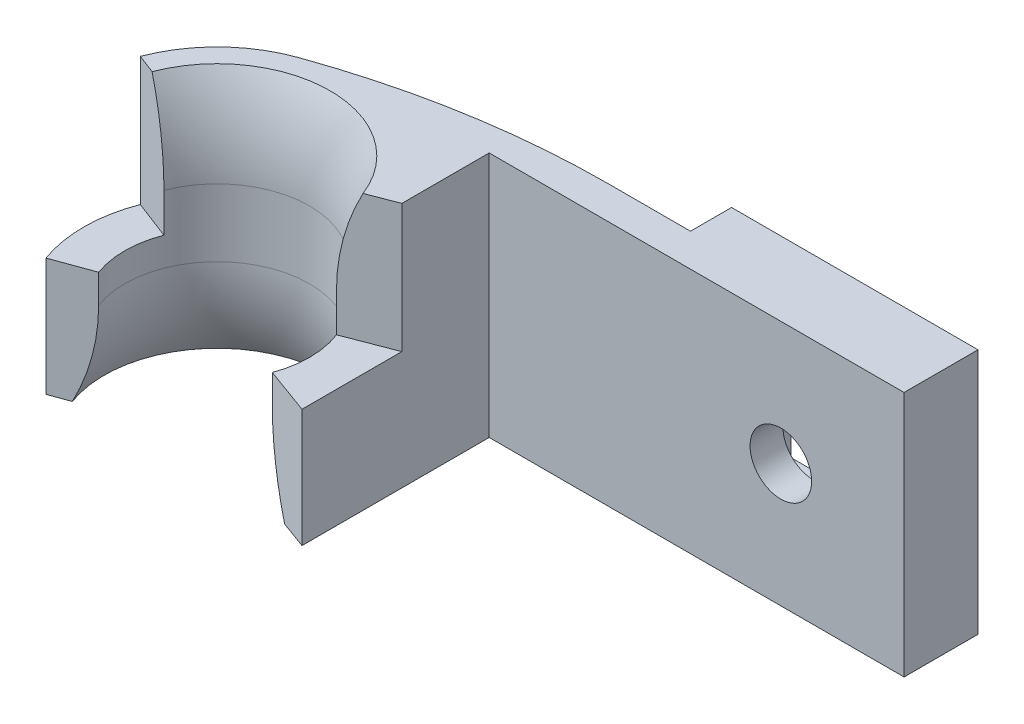
ISO-10303-21;
HEADER;
FILE_DESCRIPTION(('STEP AP214'),'2;1');
FILE_NAME('part.step','',(''),(''),'','','');
FILE_SCHEMA(('AUTOMOTIVE_DESIGN { 1 0 10303 214 1 1 1 1 }'));
ENDSEC;
DATA;
#1=APPLICATION_CONTEXT('core data for automotive mechanical design processes');
#2=APPLICATION_PROTOCOL_DEFINITION('international standard','automotive_design',2000,#1);
#3=PRODUCT_CONTEXT('',#1,'mechanical');
#4=PRODUCT('Part','Part','',(#3));
#5=PRODUCT_RELATED_PRODUCT_CATEGORY('part','',(#4));
#6=PRODUCT_DEFINITION_FORMATION('','',#4);
#7=PRODUCT_DEFINITION_CONTEXT('part definition',#1,'design');
#8=PRODUCT_DEFINITION('design','',#6,#7);
#9=PRODUCT_DEFINITION_SHAPE('','',#8);
#10=(LENGTH_UNIT() NAMED_UNIT(*) SI_UNIT(.MILLI.,.METRE.));
#11=(NAMED_UNIT(*) PLANE_ANGLE_UNIT() SI_UNIT($,.RADIAN.));
#12=(NAMED_UNIT(*) SI_UNIT($,.STERADIAN.) SOLID_ANGLE_UNIT());
#13=UNCERTAINTY_MEASURE_WITH_UNIT(LENGTH_MEASURE(1.E-05),#10,'distance_accuracy_value','');
#14=(GEOMETRIC_REPRESENTATION_CONTEXT(3) GLOBAL_UNCERTAINTY_ASSIGNED_CONTEXT((#13)) GLOBAL_UNIT_ASSIGNED_CONTEXT((#10,
#11,#12)) REPRESENTATION_CONTEXT('',''));
#15=CARTESIAN_POINT('',(0.,0.,0.));
#16=DIRECTION('',(0.,0.,1.));
#17=DIRECTION('',(1.,0.,0.));
#18=AXIS2_PLACEMENT_3D('',#15,#16,#17);
#19=CARTESIAN_POINT('',(-20.7,6.,0.));
#20=DIRECTION('',(0.,-1.,0.));
#21=DIRECTION('',(0.,0.,-1.));
#22=AXIS2_PLACEMENT_3D('',#19,#20,#21);
#23=CYLINDRICAL_SURFACE('',#22,6.5);
#24=DIRECTION('',(0.,-1.,0.));
#25=VECTOR('',#24,1.);
#26=CARTESIAN_POINT('',(-26.7682727722318,21.808608918889,-2.32939167204445));
#27=LINE('',#26,#25);
#28=CARTESIAN_POINT('',(-26.7682727722318,6.,-2.32939167204446));
#29=VERTEX_POINT('',#28);
#30=CARTESIAN_POINT('',(-26.7682727722318,-0.25,-2.32939167204445));
#31=VERTEX_POINT('',#30);
#32=EDGE_CURVE('E234',#29,#31,#27,.T.);
#33=ORIENTED_EDGE('',*,*,#32,.F.);
#34=CARTESIAN_POINT('',(-20.7,6.,0.));
#35=DIRECTION('',(0.,1.,0.));
#36=DIRECTION('',(0.,0.,1.));
#37=AXIS2_PLACEMENT_3D('',#34,#35,#36);
#38=CIRCLE('',#37,6.5);
#39=CARTESIAN_POINT('',(-22.8824234071875,6.,-6.1226651118414));
#40=VERTEX_POINT('',#39);
#41=EDGE_CURVE('E295',#40,#29,#38,.T.);
#42=ORIENTED_EDGE('',*,*,#41,.F.);
#43=DIRECTION('',(0.,-1.,0.));
#44=VECTOR('',#43,1.);
#45=CARTESIAN_POINT('',(-22.8824234071875,6.,-6.1226651118414));
#46=LINE('',#45,#44);
#47=CARTESIAN_POINT('',(-22.8824234071875,-6.,-6.1226651118414));
#48=VERTEX_POINT('',#47);
#49=EDGE_CURVE('E320',#40,#48,#46,.T.);
#50=ORIENTED_EDGE('',*,*,#49,.T.);
#51=CARTESIAN_POINT('',(-20.7,-6.,0.));
#52=DIRECTION('',(0.,1.,0.));
#53=DIRECTION('',(0.,0.,1.));
#54=AXIS2_PLACEMENT_3D('',#51,#52,#53);
#55=CIRCLE('',#54,6.5);
#56=CARTESIAN_POINT('',(-26.8080020351084,-6.,2.22313093161685));
#57=VERTEX_POINT('',#56);
#58=EDGE_CURVE('E309',#48,#57,#55,.T.);
#59=ORIENTED_EDGE('',*,*,#58,.T.);
#60=DIRECTION('',(0.,1.,0.));
#61=VECTOR('',#60,1.);
#62=CARTESIAN_POINT('',(-26.8080020351084,-21.7353908530576,2.22313093161685));
#63=LINE('',#62,#61);
#64=CARTESIAN_POINT('',(-26.8080020351084,-0.25,2.22313093161685));
#65=VERTEX_POINT('',#64);
#66=EDGE_CURVE('E276',#57,#65,#63,.T.);
#67=ORIENTED_EDGE('',*,*,#66,.T.);
#68=CARTESIAN_POINT('',(-20.7,-0.25,0.));
#69=DIRECTION('',(0.,1.,0.));
#70=DIRECTION('',(0.,0.,1.));
#71=AXIS2_PLACEMENT_3D('',#68,#69,#70);
#72=CIRCLE('',#71,6.5);
#73=EDGE_CURVE('E269',#31,#65,#72,.T.);
#74=ORIENTED_EDGE('',*,*,#73,.F.);
#75=EDGE_LOOP('',(#33,#42,#50,#59,#67,#74));
#76=FACE_BOUND('',#75,.T.);
#77=ADVANCED_FACE('F35',(#76),#23,.T.);
#78=CARTESIAN_POINT('',(-20.7,6.,0.));
#79=DIRECTION('',(0.,-1.,0.));
#80=DIRECTION('',(0.,0.,-1.));
#81=AXIS2_PLACEMENT_3D('',#78,#79,#80);
#82=CYLINDRICAL_SURFACE('',#81,4.5);
#83=DIRECTION('',(0.,1.,0.));
#84=VECTOR('',#83,1.);
#85=CARTESIAN_POINT('',(-24.9286167935366,-21.7353908530576,1.53909064496551));
#86=LINE('',#85,#84);
#87=CARTESIAN_POINT('',(-24.9286167935366,-1.64110105645931,1.53909064496551));
#88=VERTEX_POINT('',#87);
#89=CARTESIAN_POINT('',(-24.9286167935366,-0.25,1.53909064496551));
#90=VERTEX_POINT('',#89);
#91=EDGE_CURVE('E261',#88,#90,#86,.T.);
#92=ORIENTED_EDGE('',*,*,#91,.F.);
#93=CARTESIAN_POINT('',(-20.7,-1.64110105645931,0.));
#94=DIRECTION('',(0.,-1.,0.));
#95=DIRECTION('',(0.,0.,-1.));
#96=AXIS2_PLACEMENT_3D('',#93,#94,#95);
#97=CIRCLE('',#96,4.5);
#98=CARTESIAN_POINT('',(-16.4713832064634,-1.64110105645931,1.53909064496551));
#99=VERTEX_POINT('',#98);
#100=EDGE_CURVE('E332',#88,#99,#97,.T.);
#101=ORIENTED_EDGE('',*,*,#100,.T.);
#102=DIRECTION('',(0.,1.,0.));
#103=VECTOR('',#102,1.);
#104=CARTESIAN_POINT('',(-16.4713832064634,-21.7353908530576,1.53909064496551));
#105=LINE('',#104,#103);
#106=CARTESIAN_POINT('',(-16.4713832064634,-0.25,1.53909064496551));
#107=VERTEX_POINT('',#106);
#108=EDGE_CURVE('E274',#99,#107,#105,.T.);
#109=ORIENTED_EDGE('',*,*,#108,.T.);
#110=CARTESIAN_POINT('',(-20.7,-0.25,0.));
#111=DIRECTION('',(0.,-1.,0.));
#112=DIRECTION('',(0.,0.,1.));
#113=AXIS2_PLACEMENT_3D('',#110,#111,#112);
#114=CIRCLE('',#113,4.5);
#115=CARTESIAN_POINT('',(-16.4988880807626,-0.25,-1.61265577295385));
#116=VERTEX_POINT('',#115);
#117=EDGE_CURVE('E250',#116,#107,#114,.T.);
#118=ORIENTED_EDGE('',*,*,#117,.F.);
#119=DIRECTION('',(0.,-1.,0.));
#120=VECTOR('',#119,1.);
#121=CARTESIAN_POINT('',(-16.4988880807626,21.808608918889,-1.61265577295385));
#122=LINE('',#121,#120);
#123=CARTESIAN_POINT('',(-16.4988880807626,1.64110105645934,-1.61265577295385));
#124=VERTEX_POINT('',#123);
#125=EDGE_CURVE('E245',#124,#116,#122,.T.);
#126=ORIENTED_EDGE('',*,*,#125,.F.);
#127=CARTESIAN_POINT('',(-20.7,1.64110105645934,0.));
#128=DIRECTION('',(0.,1.,0.));
#129=DIRECTION('',(0.,0.,1.));
#130=AXIS2_PLACEMENT_3D('',#127,#128,#129);
#131=CIRCLE('',#130,4.5);
#132=CARTESIAN_POINT('',(-24.9011119192374,1.64110105645934,-1.61265577295385));
#133=VERTEX_POINT('',#132);
#134=EDGE_CURVE('E329',#124,#133,#131,.T.);
#135=ORIENTED_EDGE('',*,*,#134,.T.);
#136=DIRECTION('',(0.,-1.,0.));
#137=VECTOR('',#136,1.);
#138=CARTESIAN_POINT('',(-24.9011119192374,21.808608918889,-1.61265577295385));
#139=LINE('',#138,#137);
#140=CARTESIAN_POINT('',(-24.9011119192374,-0.25,-1.61265577295385));
#141=VERTEX_POINT('',#140);
#142=EDGE_CURVE('E241',#133,#141,#139,.T.);
#143=ORIENTED_EDGE('',*,*,#142,.T.);
#144=EDGE_CURVE('E262',#90,#141,#114,.T.);
#145=ORIENTED_EDGE('',*,*,#144,.F.);
#146=EDGE_LOOP('',(#92,#101,#109,#118,#126,#135,#143,#145));
#147=FACE_BOUND('',#146,.T.);
#148=ADVANCED_FACE('F359',(#147),#82,.F.);
#149=CARTESIAN_POINT('',(-14.2,6.,-6.75));
#150=DIRECTION('',(-1.,0.,0.));
#151=DIRECTION('',(0.,0.,1.));
#152=AXIS2_PLACEMENT_3D('',#149,#150,#151);
#153=PLANE('',#152);
#154=DIRECTION('',(0.,-1.,0.));
#155=VECTOR('',#154,1.);
#156=CARTESIAN_POINT('',(-14.2,21.808608918889,-2.49511622773021));
#157=LINE('',#156,#155);
#158=CARTESIAN_POINT('',(-14.2,6.,-2.49511622773021));
#159=VERTEX_POINT('',#158);
#160=CARTESIAN_POINT('',(-14.2,-0.25,-2.49511622773021));
#161=VERTEX_POINT('',#160);
#162=EDGE_CURVE('E246',#159,#161,#157,.T.);
#163=ORIENTED_EDGE('',*,*,#162,.T.);
#164=DIRECTION('',(0.,0.,-1.));
#165=VECTOR('',#164,1.);
#166=CARTESIAN_POINT('',(-14.2,-0.25,0.));
#167=LINE('',#166,#165);
#168=CARTESIAN_POINT('',(-14.2,-0.25,2.36580652273032));
#169=VERTEX_POINT('',#168);
#170=EDGE_CURVE('E267',#169,#161,#167,.T.);
#171=ORIENTED_EDGE('',*,*,#170,.F.);
#172=DIRECTION('',(0.,1.,0.));
#173=VECTOR('',#172,1.);
#174=CARTESIAN_POINT('',(-14.2,-21.7353908530576,2.36580652273032));
#175=LINE('',#174,#173);
#176=CARTESIAN_POINT('',(-14.2,-6.,2.36580652273032));
#177=VERTEX_POINT('',#176);
#178=EDGE_CURVE('E279',#177,#169,#175,.T.);
#179=ORIENTED_EDGE('',*,*,#178,.F.);
#180=DIRECTION('',(0.,0.,-1.));
#181=VECTOR('',#180,1.);
#182=CARTESIAN_POINT('',(-14.2,-6.,-6.75));
#183=LINE('',#182,#181);
#184=CARTESIAN_POINT('',(-14.2,-6.,-6.75));
#185=VERTEX_POINT('',#184);
#186=EDGE_CURVE('E312',#177,#185,#183,.T.);
#187=ORIENTED_EDGE('',*,*,#186,.T.);
#188=DIRECTION('',(0.,-1.,0.));
#189=VECTOR('',#188,1.);
#190=CARTESIAN_POINT('',(-14.2,6.,-6.75));
#191=LINE('',#190,#189);
#192=CARTESIAN_POINT('',(-14.2,6.,-6.75));
#193=VERTEX_POINT('',#192);
#194=EDGE_CURVE('E317',#193,#185,#191,.T.);
#195=ORIENTED_EDGE('',*,*,#194,.F.);
#196=DIRECTION('',(0.,0.,-1.));
#197=VECTOR('',#196,1.);
#198=CARTESIAN_POINT('',(-14.2,6.,-6.75));
#199=LINE('',#198,#197);
#200=EDGE_CURVE('E298',#159,#193,#199,.T.);
#201=ORIENTED_EDGE('',*,*,#200,.F.);
#202=EDGE_LOOP('',(#163,#171,#179,#187,#195,#201));
#203=FACE_BOUND('',#202,.T.);
#204=ADVANCED_FACE('F368',(#203),#153,.F.);
#205=CARTESIAN_POINT('',(-20.7,6.,0.));
#206=DIRECTION('',(0.,1.,0.));
#207=DIRECTION('',(0.,0.,1.));
#208=AXIS2_PLACEMENT_3D('',#205,#206,#207);
#209=PLANE('',#208);
#210=DIRECTION('',(-0.933580426497202,0.,-0.3583679495453));
#211=VECTOR('',#210,1.);
#212=CARTESIAN_POINT('',(-24.9011119192374,6.,-1.61265577295385));
#213=LINE('',#212,#211);
#214=CARTESIAN_POINT('',(-25.8346923457346,6.,-1.97102372249915));
#215=VERTEX_POINT('',#214);
#216=EDGE_CURVE('E240',#215,#29,#213,.T.);
#217=ORIENTED_EDGE('',*,*,#216,.F.);
#218=CARTESIAN_POINT('',(-20.7,6.,0.));
#219=DIRECTION('',(0.,1.,0.));
#220=DIRECTION('',(0.,0.,1.));
#221=AXIS2_PLACEMENT_3D('',#218,#219,#220);
#222=CIRCLE('',#221,5.5);
#223=CARTESIAN_POINT('',(-15.5653076542654,6.,-1.97102372249915));
#224=VERTEX_POINT('',#223);
#225=EDGE_CURVE('E327',#215,#224,#222,.F.);
#226=ORIENTED_EDGE('',*,*,#225,.T.);
#227=DIRECTION('',(-0.933580426497201,0.,0.358367949545301));
#228=VECTOR('',#227,1.);
#229=CARTESIAN_POINT('',(-16.4988880807626,6.,-1.61265577295385));
#230=LINE('',#229,#228);
#231=EDGE_CURVE('E247',#159,#224,#230,.T.);
#232=ORIENTED_EDGE('',*,*,#231,.F.);
#233=ORIENTED_EDGE('',*,*,#200,.T.);
#234=DIRECTION('',(1.,0.,0.));
#235=VECTOR('',#234,1.);
#236=CARTESIAN_POINT('',(6.,6.,-6.75));
#237=LINE('',#236,#235);
#238=CARTESIAN_POINT('',(6.,6.,-6.75));
#239=VERTEX_POINT('',#238);
#240=EDGE_CURVE('E300',#193,#239,#237,.T.);
#241=ORIENTED_EDGE('',*,*,#240,.T.);
#242=DIRECTION('',(0.,0.,-1.));
#243=VECTOR('',#242,1.);
#244=CARTESIAN_POINT('',(6.,6.,-8.35));
#245=LINE('',#244,#243);
#246=CARTESIAN_POINT('',(6.,6.,-10.35));
#247=VERTEX_POINT('',#246);
#248=EDGE_CURVE('E289',#239,#247,#245,.T.);
#249=ORIENTED_EDGE('',*,*,#248,.T.);
#250=DIRECTION('',(-1.,0.,0.));
#251=VECTOR('',#250,1.);
#252=CARTESIAN_POINT('',(6.,6.,-10.35));
#253=LINE('',#252,#251);
#254=CARTESIAN_POINT('',(-6.,6.,-10.35));
#255=VERTEX_POINT('',#254);
#256=EDGE_CURVE('E220',#247,#255,#253,.T.);
#257=ORIENTED_EDGE('',*,*,#256,.T.);
#258=DIRECTION('',(0.,0.,1.));
#259=VECTOR('',#258,1.);
#260=CARTESIAN_POINT('',(-6.,6.,-8.35));
#261=LINE('',#260,#259);
#262=CARTESIAN_POINT('',(-6.,6.,-8.35));
#263=VERTEX_POINT('',#262);
#264=EDGE_CURVE('E221',#255,#263,#261,.T.);
#265=ORIENTED_EDGE('',*,*,#264,.T.);
#266=DIRECTION('',(-1.,0.,0.));
#267=VECTOR('',#266,1.);
#268=CARTESIAN_POINT('',(-10.,6.,-8.35));
#269=LINE('',#268,#267);
#270=CARTESIAN_POINT('',(-9.99999999999999,6.,-8.35));
#271=VERTEX_POINT('',#270);
#272=EDGE_CURVE('E58',#263,#271,#269,.T.);
#273=ORIENTED_EDGE('',*,*,#272,.T.);
#274=CARTESIAN_POINT('',(-10.,6.,30.0182432432432));
#275=DIRECTION('',(0.,1.,0.));
#276=DIRECTION('',(0.,0.,1.));
#277=AXIS2_PLACEMENT_3D('',#274,#275,#276);
#278=CIRCLE('',#277,38.3682432432432);
#279=EDGE_CURVE('E293',#271,#40,#278,.T.);
#280=ORIENTED_EDGE('',*,*,#279,.T.);
#281=ORIENTED_EDGE('',*,*,#41,.T.);
#282=EDGE_LOOP('',(#217,#226,#232,#233,#241,#249,#257,#265,#273,#280,#281));
#283=FACE_BOUND('',#282,.T.);
#284=ADVANCED_FACE('F348',(#283),#209,.T.);
#285=CARTESIAN_POINT('',(6.,6.,-8.35));
#286=DIRECTION('',(-1.,0.,0.));
#287=DIRECTION('',(0.,0.,1.));
#288=AXIS2_PLACEMENT_3D('',#285,#286,#287);
#289=PLANE('',#288);
#290=DIRECTION('',(0.,0.,-1.));
#291=VECTOR('',#290,1.);
#292=CARTESIAN_POINT('',(6.,-6.,-8.35));
#293=LINE('',#292,#291);
#294=CARTESIAN_POINT('',(6.,-6.,-6.75));
#295=VERTEX_POINT('',#294);
#296=CARTESIAN_POINT('',(6.,-6.,-10.35));
#297=VERTEX_POINT('',#296);
#298=EDGE_CURVE('E288',#295,#297,#293,.T.);
#299=ORIENTED_EDGE('',*,*,#298,.T.);
#300=DIRECTION('',(0.,1.,0.));
#301=VECTOR('',#300,1.);
#302=CARTESIAN_POINT('',(6.,6.,-10.35));
#303=LINE('',#302,#301);
#304=EDGE_CURVE('E217',#297,#247,#303,.T.);
#305=ORIENTED_EDGE('',*,*,#304,.T.);
#306=ORIENTED_EDGE('',*,*,#248,.F.);
#307=DIRECTION('',(0.,-1.,0.));
#308=VECTOR('',#307,1.);
#309=CARTESIAN_POINT('',(6.,6.,-6.75));
#310=LINE('',#309,#308);
#311=EDGE_CURVE('E302',#239,#295,#310,.T.);
#312=ORIENTED_EDGE('',*,*,#311,.T.);
#313=EDGE_LOOP('',(#299,#305,#306,#312));
#314=FACE_BOUND('',#313,.T.);
#315=ADVANCED_FACE('F379',(#314),#289,.F.);
#316=CARTESIAN_POINT('',(-10.,6.,-8.35));
#317=DIRECTION('',(0.,0.,1.));
#318=DIRECTION('',(1.,0.,0.));
#319=AXIS2_PLACEMENT_3D('',#316,#317,#318);
#320=PLANE('',#319);
#321=ORIENTED_EDGE('',*,*,#272,.F.);
#322=DIRECTION('',(0.,-1.,0.));
#323=VECTOR('',#322,1.);
#324=CARTESIAN_POINT('',(-6.,6.,-8.35));
#325=LINE('',#324,#323);
#326=CARTESIAN_POINT('',(-6.,-6.,-8.35));
#327=VERTEX_POINT('',#326);
#328=EDGE_CURVE('E222',#263,#327,#325,.T.);
#329=ORIENTED_EDGE('',*,*,#328,.T.);
#330=DIRECTION('',(-1.,0.,0.));
#331=VECTOR('',#330,1.);
#332=CARTESIAN_POINT('',(-10.,-6.,-8.35));
#333=LINE('',#332,#331);
#334=CARTESIAN_POINT('',(-9.99999999999999,-6.,-8.35));
#335=VERTEX_POINT('',#334);
#336=EDGE_CURVE('E304',#327,#335,#333,.T.);
#337=ORIENTED_EDGE('',*,*,#336,.T.);
#338=DIRECTION('',(0.,-1.,0.));
#339=VECTOR('',#338,1.);
#340=CARTESIAN_POINT('',(-9.99999999999999,6.,-8.35));
#341=LINE('',#340,#339);
#342=EDGE_CURVE('E322',#271,#335,#341,.T.);
#343=ORIENTED_EDGE('',*,*,#342,.F.);
#344=EDGE_LOOP('',(#321,#329,#337,#343));
#345=FACE_BOUND('',#344,.T.);
#346=ADVANCED_FACE('F391',(#345),#320,.F.);
#347=CARTESIAN_POINT('',(-10.,6.,30.0182432432432));
#348=DIRECTION('',(0.,-1.,0.));
#349=DIRECTION('',(0.,0.,-1.));
#350=AXIS2_PLACEMENT_3D('',#347,#348,#349);
#351=CYLINDRICAL_SURFACE('',#350,38.3682432432432);
#352=CARTESIAN_POINT('',(-10.,-6.,30.0182432432432));
#353=DIRECTION('',(0.,1.,0.));
#354=DIRECTION('',(0.,0.,1.));
#355=AXIS2_PLACEMENT_3D('',#352,#353,#354);
#356=CIRCLE('',#355,38.3682432432432);
#357=EDGE_CURVE('E306',#335,#48,#356,.T.);
#358=ORIENTED_EDGE('',*,*,#357,.T.);
#359=ORIENTED_EDGE('',*,*,#49,.F.);
#360=ORIENTED_EDGE('',*,*,#279,.F.);
#361=ORIENTED_EDGE('',*,*,#342,.T.);
#362=EDGE_LOOP('',(#358,#359,#360,#361));
#363=FACE_BOUND('',#362,.T.);
#364=ADVANCED_FACE('F396',(#363),#351,.T.);
#365=CARTESIAN_POINT('',(6.,6.,-6.75));
#366=DIRECTION('',(0.,0.,-1.));
#367=DIRECTION('',(-1.,0.,0.));
#368=AXIS2_PLACEMENT_3D('',#365,#366,#367);
#369=PLANE('',#368);
#370=CARTESIAN_POINT('',(0.,0.,-6.75));
#371=DIRECTION('',(0.,0.,1.));
#372=DIRECTION('',(1.,0.,0.));
#373=AXIS2_PLACEMENT_3D('',#370,#371,#372);
#374=CIRCLE('',#373,1.5);
#375=CARTESIAN_POINT('',(1.5,0.,-6.75));
#376=VERTEX_POINT('',#375);
#377=EDGE_CURVE('E285',#376,#376,#374,.T.);
#378=ORIENTED_EDGE('',*,*,#377,.F.);
#379=EDGE_LOOP('',(#378));
#380=FACE_BOUND('',#379,.T.);
#381=DIRECTION('',(1.,0.,0.));
#382=VECTOR('',#381,1.);
#383=CARTESIAN_POINT('',(6.,-6.,-6.75));
#384=LINE('',#383,#382);
#385=EDGE_CURVE('E291',#185,#295,#384,.T.);
#386=ORIENTED_EDGE('',*,*,#385,.T.);
#387=ORIENTED_EDGE('',*,*,#311,.F.);
#388=ORIENTED_EDGE('',*,*,#240,.F.);
#389=ORIENTED_EDGE('',*,*,#194,.T.);
#390=EDGE_LOOP('',(#386,#387,#388,#389));
#391=FACE_BOUND('',#390,.T.);
#392=ADVANCED_FACE('F375',(#380,#391),#369,.F.);
#393=CARTESIAN_POINT('',(-20.7,-6.,0.));
#394=DIRECTION('',(0.,1.,0.));
#395=DIRECTION('',(0.,0.,1.));
#396=AXIS2_PLACEMENT_3D('',#393,#394,#395);
#397=PLANE('',#396);
#398=DIRECTION('',(-0.939692620785908,0.,-0.34202014332567));
#399=VECTOR('',#398,1.);
#400=CARTESIAN_POINT('',(-16.4713832064634,-6.,1.53909064496551));
#401=LINE('',#400,#399);
#402=CARTESIAN_POINT('',(-15.5316905856775,-6.,1.88111078829119));
#403=VERTEX_POINT('',#402);
#404=EDGE_CURVE('E260',#177,#403,#401,.T.);
#405=ORIENTED_EDGE('',*,*,#404,.T.);
#406=CARTESIAN_POINT('',(-20.7,-6.,0.));
#407=DIRECTION('',(0.,1.,0.));
#408=DIRECTION('',(0.,0.,1.));
#409=AXIS2_PLACEMENT_3D('',#406,#407,#408);
#410=CIRCLE('',#409,5.50000000000001);
#411=CARTESIAN_POINT('',(-25.8683094143225,-6.,1.88111078829119));
#412=VERTEX_POINT('',#411);
#413=EDGE_CURVE('E325',#403,#412,#410,.T.);
#414=ORIENTED_EDGE('',*,*,#413,.T.);
#415=DIRECTION('',(-0.939692620785908,0.,0.34202014332567));
#416=VECTOR('',#415,1.);
#417=CARTESIAN_POINT('',(-24.9286167935366,-6.,1.53909064496551));
#418=LINE('',#417,#416);
#419=EDGE_CURVE('E258',#412,#57,#418,.T.);
#420=ORIENTED_EDGE('',*,*,#419,.T.);
#421=ORIENTED_EDGE('',*,*,#58,.F.);
#422=ORIENTED_EDGE('',*,*,#357,.F.);
#423=ORIENTED_EDGE('',*,*,#336,.F.);
#424=DIRECTION('',(0.,0.,-1.));
#425=VECTOR('',#424,1.);
#426=CARTESIAN_POINT('',(-6.,-6.,-10.35));
#427=LINE('',#426,#425);
#428=CARTESIAN_POINT('',(-6.,-6.,-10.35));
#429=VERTEX_POINT('',#428);
#430=EDGE_CURVE('E224',#327,#429,#427,.T.);
#431=ORIENTED_EDGE('',*,*,#430,.T.);
#432=DIRECTION('',(-1.,0.,0.));
#433=VECTOR('',#432,1.);
#434=CARTESIAN_POINT('',(6.,-6.,-10.35));
#435=LINE('',#434,#433);
#436=EDGE_CURVE('E231',#297,#429,#435,.T.);
#437=ORIENTED_EDGE('',*,*,#436,.F.);
#438=ORIENTED_EDGE('',*,*,#298,.F.);
#439=ORIENTED_EDGE('',*,*,#385,.F.);
#440=ORIENTED_EDGE('',*,*,#186,.F.);
#441=EDGE_LOOP('',(#405,#414,#420,#421,#422,#423,#431,#437,#438,#439,#440));
#442=FACE_BOUND('',#441,.T.);
#443=ADVANCED_FACE('F399',(#442),#397,.F.);
#444=CARTESIAN_POINT('',(0.,0.,-8.351));
#445=DIRECTION('',(0.,0.,1.));
#446=DIRECTION('',(1.,0.,0.));
#447=AXIS2_PLACEMENT_3D('',#444,#445,#446);
#448=CYLINDRICAL_SURFACE('',#447,1.5);
#449=ORIENTED_EDGE('',*,*,#377,.T.);
#450=EDGE_LOOP('',(#449));
#451=FACE_BOUND('',#450,.T.);
#452=CARTESIAN_POINT('',(0.,0.,-8.35));
#453=DIRECTION('',(0.,0.,-1.));
#454=DIRECTION('',(-1.,0.,0.));
#455=AXIS2_PLACEMENT_3D('',#452,#453,#454);
#456=CIRCLE('',#455,1.5);
#457=CARTESIAN_POINT('',(-1.5,0.,-8.35));
#458=VERTEX_POINT('',#457);
#459=EDGE_CURVE('E213',#458,#458,#456,.F.);
#460=ORIENTED_EDGE('',*,*,#459,.F.);
#461=EDGE_LOOP('',(#460));
#462=FACE_BOUND('',#461,.T.);
#463=ADVANCED_FACE('F418',(#451,#462),#448,.F.);
#464=CARTESIAN_POINT('',(-16.4713832064634,-21.7353908530576,1.53909064496551));
#465=DIRECTION('',(-0.34202014332567,0.,0.939692620785908));
#466=DIRECTION('',(0.939692620785908,0.,0.34202014332567));
#467=AXIS2_PLACEMENT_3D('',#464,#465,#466);
#468=PLANE('',#467);
#469=ORIENTED_EDGE('',*,*,#108,.F.);
#470=CARTESIAN_POINT('',(-7.07445699860433,-1.64110105645931,4.95929207822221));
#471=DIRECTION('',(-0.34202014332567,0.,0.939692620785908));
#472=DIRECTION('',(0.939692620785908,0.,0.34202014332567));
#473=AXIS2_PLACEMENT_3D('',#470,#471,#472);
#474=CIRCLE('',#473,10.);
#475=EDGE_CURVE('E335',#99,#403,#474,.T.);
#476=ORIENTED_EDGE('',*,*,#475,.T.);
#477=ORIENTED_EDGE('',*,*,#404,.F.);
#478=ORIENTED_EDGE('',*,*,#178,.T.);
#479=DIRECTION('',(0.939692620785908,0.,0.34202014332567));
#480=VECTOR('',#479,1.);
#481=CARTESIAN_POINT('',(-16.4713832064634,-0.25,1.53909064496551));
#482=LINE('',#481,#480);
#483=EDGE_CURVE('E265',#107,#169,#482,.T.);
#484=ORIENTED_EDGE('',*,*,#483,.F.);
#485=EDGE_LOOP('',(#469,#476,#477,#478,#484));
#486=FACE_BOUND('',#485,.T.);
#487=ADVANCED_FACE('F416',(#486),#468,.T.);
#488=CARTESIAN_POINT('',(-20.7,-0.25,0.));
#489=DIRECTION('',(0.,1.,0.));
#490=DIRECTION('',(0.,0.,1.));
#491=AXIS2_PLACEMENT_3D('',#488,#489,#490);
#492=PLANE('',#491);
#493=ORIENTED_EDGE('',*,*,#483,.T.);
#494=ORIENTED_EDGE('',*,*,#170,.T.);
#495=DIRECTION('',(-0.933580426497201,0.,0.358367949545301));
#496=VECTOR('',#495,1.);
#497=CARTESIAN_POINT('',(-16.4988880807626,-0.25,-1.61265577295385));
#498=LINE('',#497,#496);
#499=EDGE_CURVE('E242',#161,#116,#498,.T.);
#500=ORIENTED_EDGE('',*,*,#499,.T.);
#501=ORIENTED_EDGE('',*,*,#117,.T.);
#502=EDGE_LOOP('',(#493,#494,#500,#501));
#503=FACE_BOUND('',#502,.T.);
#504=ADVANCED_FACE('F364',(#503),#492,.T.);
#505=ORIENTED_EDGE('',*,*,#144,.T.);
#506=DIRECTION('',(-0.933580426497202,0.,-0.3583679495453));
#507=VECTOR('',#506,1.);
#508=CARTESIAN_POINT('',(-24.9011119192374,-0.25,-1.61265577295385));
#509=LINE('',#508,#507);
#510=EDGE_CURVE('E237',#141,#31,#509,.T.);
#511=ORIENTED_EDGE('',*,*,#510,.T.);
#512=ORIENTED_EDGE('',*,*,#73,.T.);
#513=DIRECTION('',(0.939692620785908,0.,-0.34202014332567));
#514=VECTOR('',#513,1.);
#515=CARTESIAN_POINT('',(-24.9286167935366,-0.25,1.53909064496551));
#516=LINE('',#515,#514);
#517=EDGE_CURVE('E271',#65,#90,#516,.T.);
#518=ORIENTED_EDGE('',*,*,#517,.T.);
#519=EDGE_LOOP('',(#505,#511,#512,#518));
#520=FACE_BOUND('',#519,.T.);
#521=ADVANCED_FACE('F409',(#520),#492,.T.);
#522=CARTESIAN_POINT('',(-24.9286167935366,-21.7353908530576,1.53909064496551));
#523=DIRECTION('',(0.34202014332567,0.,0.939692620785908));
#524=DIRECTION('',(0.939692620785908,0.,-0.34202014332567));
#525=AXIS2_PLACEMENT_3D('',#522,#523,#524);
#526=PLANE('',#525);
#527=ORIENTED_EDGE('',*,*,#419,.F.);
#528=CARTESIAN_POINT('',(-34.3255430013957,-1.64110105645931,4.95929207822221));
#529=DIRECTION('',(0.34202014332567,0.,0.939692620785908));
#530=DIRECTION('',(0.939692620785908,0.,-0.34202014332567));
#531=AXIS2_PLACEMENT_3D('',#528,#529,#530);
#532=CIRCLE('',#531,10.);
#533=EDGE_CURVE('E337',#412,#88,#532,.T.);
#534=ORIENTED_EDGE('',*,*,#533,.T.);
#535=ORIENTED_EDGE('',*,*,#91,.T.);
#536=ORIENTED_EDGE('',*,*,#517,.F.);
#537=ORIENTED_EDGE('',*,*,#66,.F.);
#538=EDGE_LOOP('',(#527,#534,#535,#536,#537));
#539=FACE_BOUND('',#538,.T.);
#540=ADVANCED_FACE('F405',(#539),#526,.T.);
#541=CARTESIAN_POINT('',(-24.9011119192374,21.808608918889,-1.61265577295385));
#542=DIRECTION('',(-0.3583679495453,0.,0.933580426497202));
#543=DIRECTION('',(0.933580426497202,0.,0.3583679495453));
#544=AXIS2_PLACEMENT_3D('',#541,#542,#543);
#545=PLANE('',#544);
#546=ORIENTED_EDGE('',*,*,#142,.F.);
#547=CARTESIAN_POINT('',(-34.2369161842094,1.64110105645934,-5.19633526840686));
#548=DIRECTION('',(-0.3583679495453,0.,0.933580426497202));
#549=DIRECTION('',(0.933580426497202,0.,0.3583679495453));
#550=AXIS2_PLACEMENT_3D('',#547,#548,#549);
#551=CIRCLE('',#550,10.);
#552=EDGE_CURVE('E43',#133,#215,#551,.T.);
#553=ORIENTED_EDGE('',*,*,#552,.T.);
#554=ORIENTED_EDGE('',*,*,#216,.T.);
#555=ORIENTED_EDGE('',*,*,#32,.T.);
#556=ORIENTED_EDGE('',*,*,#510,.F.);
#557=EDGE_LOOP('',(#546,#553,#554,#555,#556));
#558=FACE_BOUND('',#557,.T.);
#559=ADVANCED_FACE('F341',(#558),#545,.T.);
#560=CARTESIAN_POINT('',(-16.4988880807626,21.808608918889,-1.61265577295385));
#561=DIRECTION('',(0.358367949545301,0.,0.933580426497201));
#562=DIRECTION('',(0.933580426497201,0.,-0.358367949545301));
#563=AXIS2_PLACEMENT_3D('',#560,#561,#562);
#564=PLANE('',#563);
#565=ORIENTED_EDGE('',*,*,#231,.T.);
#566=CARTESIAN_POINT('',(-7.16308381579058,1.64110105645934,-5.19633526840687));
#567=DIRECTION('',(0.358367949545301,0.,0.933580426497201));
#568=DIRECTION('',(0.933580426497201,0.,-0.358367949545301));
#569=AXIS2_PLACEMENT_3D('',#566,#567,#568);
#570=CIRCLE('',#569,10.);
#571=EDGE_CURVE('E11',#224,#124,#570,.T.);
#572=ORIENTED_EDGE('',*,*,#571,.T.);
#573=ORIENTED_EDGE('',*,*,#125,.T.);
#574=ORIENTED_EDGE('',*,*,#499,.F.);
#575=ORIENTED_EDGE('',*,*,#162,.F.);
#576=EDGE_LOOP('',(#565,#572,#573,#574,#575));
#577=FACE_BOUND('',#576,.T.);
#578=ADVANCED_FACE('F354',(#577),#564,.T.);
#579=CARTESIAN_POINT('',(-20.7,-1.64110105645931,0.));
#580=DIRECTION('',(0.,-1.,0.));
#581=DIRECTION('',(0.,0.,-1.));
#582=AXIS2_PLACEMENT_3D('',#579,#580,#581);
#583=TOROIDAL_SURFACE('',#582,14.5,10.);
#584=ORIENTED_EDGE('',*,*,#533,.F.);
#585=ORIENTED_EDGE('',*,*,#413,.F.);
#586=ORIENTED_EDGE('',*,*,#475,.F.);
#587=ORIENTED_EDGE('',*,*,#100,.F.);
#588=EDGE_LOOP('',(#584,#585,#586,#587));
#589=FACE_BOUND('',#588,.T.);
#590=ADVANCED_FACE('F412',(#589),#583,.T.);
#591=CARTESIAN_POINT('',(-20.7,1.64110105645934,0.));
#592=DIRECTION('',(0.,1.,0.));
#593=DIRECTION('',(0.,0.,1.));
#594=AXIS2_PLACEMENT_3D('',#591,#592,#593);
#595=TOROIDAL_SURFACE('',#594,14.5,10.);
#596=ORIENTED_EDGE('',*,*,#571,.F.);
#597=ORIENTED_EDGE('',*,*,#225,.F.);
#598=ORIENTED_EDGE('',*,*,#552,.F.);
#599=ORIENTED_EDGE('',*,*,#134,.F.);
#600=EDGE_LOOP('',(#596,#597,#598,#599));
#601=FACE_BOUND('',#600,.T.);
#602=ADVANCED_FACE('F37',(#601),#595,.T.);
#603=CARTESIAN_POINT('',(6.,6.,-10.35));
#604=DIRECTION('',(0.,0.,1.));
#605=DIRECTION('',(0.,-1.,0.));
#606=AXIS2_PLACEMENT_3D('',#603,#604,#605);
#607=PLANE('',#606);
#608=DIRECTION('',(1.,0.,0.));
#609=VECTOR('',#608,1.);
#610=CARTESIAN_POINT('',(3.1,3.1,-10.35));
#611=LINE('',#610,#609);
#612=CARTESIAN_POINT('',(-3.1,3.1,-10.35));
#613=VERTEX_POINT('',#612);
#614=CARTESIAN_POINT('',(3.1,3.1,-10.35));
#615=VERTEX_POINT('',#614);
#616=EDGE_CURVE('E207',#613,#615,#611,.T.);
#617=ORIENTED_EDGE('',*,*,#616,.F.);
#618=DIRECTION('',(0.,1.,0.));
#619=VECTOR('',#618,1.);
#620=CARTESIAN_POINT('',(-3.1,-3.1,-10.35));
#621=LINE('',#620,#619);
#622=CARTESIAN_POINT('',(-3.1,-3.1,-10.35));
#623=VERTEX_POINT('',#622);
#624=EDGE_CURVE('E50',#623,#613,#621,.T.);
#625=ORIENTED_EDGE('',*,*,#624,.F.);
#626=DIRECTION('',(-1.,0.,0.));
#627=VECTOR('',#626,1.);
#628=CARTESIAN_POINT('',(3.1,-3.1,-10.35));
#629=LINE('',#628,#627);
#630=CARTESIAN_POINT('',(3.1,-3.1,-10.35));
#631=VERTEX_POINT('',#630);
#632=EDGE_CURVE('E198',#631,#623,#629,.T.);
#633=ORIENTED_EDGE('',*,*,#632,.F.);
#634=DIRECTION('',(0.,-1.,0.));
#635=VECTOR('',#634,1.);
#636=CARTESIAN_POINT('',(3.1,-3.1,-10.35));
#637=LINE('',#636,#635);
#638=EDGE_CURVE('E201',#615,#631,#637,.T.);
#639=ORIENTED_EDGE('',*,*,#638,.F.);
#640=EDGE_LOOP('',(#617,#625,#633,#639));
#641=FACE_BOUND('',#640,.T.);
#642=DIRECTION('',(0.,1.,0.));
#643=VECTOR('',#642,1.);
#644=CARTESIAN_POINT('',(-6.,6.,-10.35));
#645=LINE('',#644,#643);
#646=EDGE_CURVE('E226',#429,#255,#645,.T.);
#647=ORIENTED_EDGE('',*,*,#646,.T.);
#648=ORIENTED_EDGE('',*,*,#256,.F.);
#649=ORIENTED_EDGE('',*,*,#304,.F.);
#650=ORIENTED_EDGE('',*,*,#436,.T.);
#651=EDGE_LOOP('',(#647,#648,#649,#650));
#652=FACE_BOUND('',#651,.T.);
#653=ADVANCED_FACE('F384',(#641,#652),#607,.F.);
#654=CARTESIAN_POINT('',(-6.,0.,0.));
#655=DIRECTION('',(-1.,0.,0.));
#656=DIRECTION('',(0.,0.,1.));
#657=AXIS2_PLACEMENT_3D('',#654,#655,#656);
#658=PLANE('',#657);
#659=ORIENTED_EDGE('',*,*,#328,.F.);
#660=ORIENTED_EDGE('',*,*,#264,.F.);
#661=ORIENTED_EDGE('',*,*,#646,.F.);
#662=ORIENTED_EDGE('',*,*,#430,.F.);
#663=EDGE_LOOP('',(#659,#660,#661,#662));
#664=FACE_BOUND('',#663,.T.);
#665=ADVANCED_FACE('F389',(#664),#658,.T.);
#666=CARTESIAN_POINT('',(-3.1,-3.1,-8.35));
#667=DIRECTION('',(-1.,0.,0.));
#668=DIRECTION('',(0.,-1.,0.));
#669=AXIS2_PLACEMENT_3D('',#666,#667,#668);
#670=PLANE('',#669);
#671=ORIENTED_EDGE('',*,*,#624,.T.);
#672=DIRECTION('',(0.,0.,-1.));
#673=VECTOR('',#672,1.);
#674=CARTESIAN_POINT('',(-3.1,3.1,-8.35));
#675=LINE('',#674,#673);
#676=CARTESIAN_POINT('',(-3.1,3.1,-8.35));
#677=VERTEX_POINT('',#676);
#678=EDGE_CURVE('E176',#677,#613,#675,.T.);
#679=ORIENTED_EDGE('',*,*,#678,.F.);
#680=DIRECTION('',(0.,1.,0.));
#681=VECTOR('',#680,1.);
#682=CARTESIAN_POINT('',(-3.1,-3.1,-8.35));
#683=LINE('',#682,#681);
#684=CARTESIAN_POINT('',(-3.1,-3.1,-8.35));
#685=VERTEX_POINT('',#684);
#686=EDGE_CURVE('E180',#685,#677,#683,.T.);
#687=ORIENTED_EDGE('',*,*,#686,.F.);
#688=DIRECTION('',(0.,0.,-1.));
#689=VECTOR('',#688,1.);
#690=CARTESIAN_POINT('',(-3.1,-3.1,-8.35));
#691=LINE('',#690,#689);
#692=EDGE_CURVE('E211',#685,#623,#691,.T.);
#693=ORIENTED_EDGE('',*,*,#692,.T.);
#694=EDGE_LOOP('',(#671,#679,#687,#693));
#695=FACE_BOUND('',#694,.T.);
#696=ADVANCED_FACE('F178',(#695),#670,.F.);
#697=CARTESIAN_POINT('',(3.1,-3.1,-8.35));
#698=DIRECTION('',(0.,-1.,0.));
#699=DIRECTION('',(0.,0.,-1.));
#700=AXIS2_PLACEMENT_3D('',#697,#698,#699);
#701=PLANE('',#700);
#702=ORIENTED_EDGE('',*,*,#632,.T.);
#703=ORIENTED_EDGE('',*,*,#692,.F.);
#704=DIRECTION('',(-1.,0.,0.));
#705=VECTOR('',#704,1.);
#706=CARTESIAN_POINT('',(3.1,-3.1,-8.35));
#707=LINE('',#706,#705);
#708=CARTESIAN_POINT('',(3.1,-3.1,-8.35));
#709=VERTEX_POINT('',#708);
#710=EDGE_CURVE('E186',#709,#685,#707,.T.);
#711=ORIENTED_EDGE('',*,*,#710,.F.);
#712=DIRECTION('',(0.,0.,-1.));
#713=VECTOR('',#712,1.);
#714=CARTESIAN_POINT('',(3.1,-3.1,-8.35));
#715=LINE('',#714,#713);
#716=EDGE_CURVE('E214',#709,#631,#715,.T.);
#717=ORIENTED_EDGE('',*,*,#716,.T.);
#718=EDGE_LOOP('',(#702,#703,#711,#717));
#719=FACE_BOUND('',#718,.T.);
#720=ADVANCED_FACE('F536',(#719),#701,.F.);
#721=CARTESIAN_POINT('',(3.1,-3.1,-8.35));
#722=DIRECTION('',(1.,0.,0.));
#723=DIRECTION('',(0.,0.,-1.));
#724=AXIS2_PLACEMENT_3D('',#721,#722,#723);
#725=PLANE('',#724);
#726=ORIENTED_EDGE('',*,*,#638,.T.);
#727=ORIENTED_EDGE('',*,*,#716,.F.);
#728=DIRECTION('',(0.,-1.,0.));
#729=VECTOR('',#728,1.);
#730=CARTESIAN_POINT('',(3.1,-3.1,-8.35));
#731=LINE('',#730,#729);
#732=CARTESIAN_POINT('',(3.1,3.1,-8.35));
#733=VERTEX_POINT('',#732);
#734=EDGE_CURVE('E194',#733,#709,#731,.T.);
#735=ORIENTED_EDGE('',*,*,#734,.F.);
#736=DIRECTION('',(0.,0.,-1.));
#737=VECTOR('',#736,1.);
#738=CARTESIAN_POINT('',(3.1,3.1,-8.35));
#739=LINE('',#738,#737);
#740=EDGE_CURVE('E185',#733,#615,#739,.T.);
#741=ORIENTED_EDGE('',*,*,#740,.T.);
#742=EDGE_LOOP('',(#726,#727,#735,#741));
#743=FACE_BOUND('',#742,.T.);
#744=ADVANCED_FACE('F545',(#743),#725,.F.);
#745=CARTESIAN_POINT('',(3.1,3.1,-8.35));
#746=DIRECTION('',(0.,1.,0.));
#747=DIRECTION('',(0.,0.,1.));
#748=AXIS2_PLACEMENT_3D('',#745,#746,#747);
#749=PLANE('',#748);
#750=ORIENTED_EDGE('',*,*,#616,.T.);
#751=ORIENTED_EDGE('',*,*,#740,.F.);
#752=DIRECTION('',(1.,0.,0.));
#753=VECTOR('',#752,1.);
#754=CARTESIAN_POINT('',(3.1,3.1,-8.35));
#755=LINE('',#754,#753);
#756=EDGE_CURVE('E189',#677,#733,#755,.T.);
#757=ORIENTED_EDGE('',*,*,#756,.F.);
#758=ORIENTED_EDGE('',*,*,#678,.T.);
#759=EDGE_LOOP('',(#750,#751,#757,#758));
#760=FACE_BOUND('',#759,.T.);
#761=ADVANCED_FACE('F190',(#760),#749,.F.);
#762=CARTESIAN_POINT('',(0.,0.,-8.35));
#763=DIRECTION('',(0.,0.,1.));
#764=DIRECTION('',(1.,0.,0.));
#765=AXIS2_PLACEMENT_3D('',#762,#763,#764);
#766=PLANE('',#765);
#767=ORIENTED_EDGE('',*,*,#459,.T.);
#768=EDGE_LOOP('',(#767));
#769=FACE_BOUND('',#768,.T.);
#770=ORIENTED_EDGE('',*,*,#686,.T.);
#771=ORIENTED_EDGE('',*,*,#756,.T.);
#772=ORIENTED_EDGE('',*,*,#734,.T.);
#773=ORIENTED_EDGE('',*,*,#710,.T.);
#774=EDGE_LOOP('',(#770,#771,#772,#773));
#775=FACE_BOUND('',#774,.T.);
#776=ADVANCED_FACE('F196',(#769,#775),#766,.F.);
#777=CLOSED_SHELL('',(#77,#148,#204,#284,#315,#346,#364,#392,#443,#463,#487,#504,#521,#540,#559,
#578,#590,#602,#653,#665,#696,#720,#744,#761,#776));
#778=MANIFOLD_SOLID_BREP('B2',#777);
#779=ADVANCED_BREP_SHAPE_REPRESENTATION('',(#18,#778),#14);
#780=SHAPE_DEFINITION_REPRESENTATION(#9,#779);
ENDSEC;
END-ISO-10303-21;
